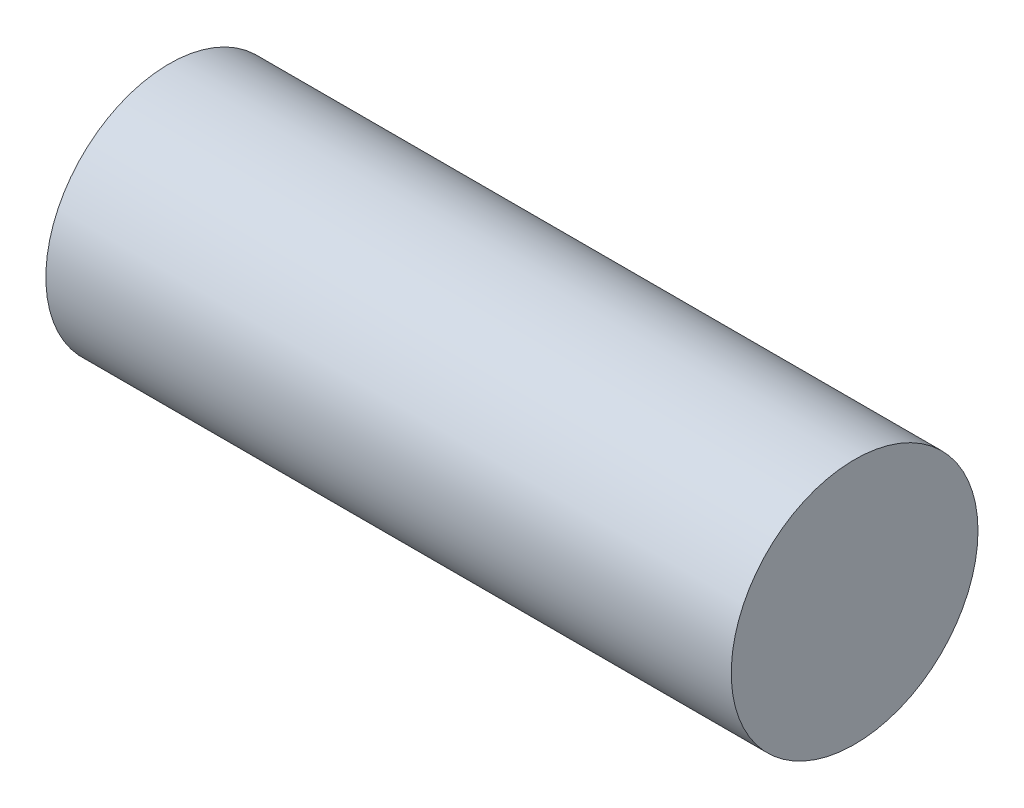
ISO-10303-21;
HEADER;
FILE_DESCRIPTION(('STEP AP214'),'2;1');
FILE_NAME('part.step','',(''),(''),'','','');
FILE_SCHEMA(('AUTOMOTIVE_DESIGN { 1 0 10303 214 1 1 1 1 }'));
ENDSEC;
DATA;
#1=APPLICATION_CONTEXT('core data for automotive mechanical design processes');
#2=APPLICATION_PROTOCOL_DEFINITION('international standard','automotive_design',2000,#1);
#3=PRODUCT_CONTEXT('',#1,'mechanical');
#4=PRODUCT('Part','Part','',(#3));
#5=PRODUCT_RELATED_PRODUCT_CATEGORY('part','',(#4));
#6=PRODUCT_DEFINITION_FORMATION('','',#4);
#7=PRODUCT_DEFINITION_CONTEXT('part definition',#1,'design');
#8=PRODUCT_DEFINITION('design','',#6,#7);
#9=PRODUCT_DEFINITION_SHAPE('','',#8);
#10=(LENGTH_UNIT() NAMED_UNIT(*) SI_UNIT(.MILLI.,.METRE.));
#11=(NAMED_UNIT(*) PLANE_ANGLE_UNIT() SI_UNIT($,.RADIAN.));
#12=(NAMED_UNIT(*) SI_UNIT($,.STERADIAN.) SOLID_ANGLE_UNIT());
#13=UNCERTAINTY_MEASURE_WITH_UNIT(LENGTH_MEASURE(1.E-05),#10,'distance_accuracy_value','');
#14=(GEOMETRIC_REPRESENTATION_CONTEXT(3) GLOBAL_UNCERTAINTY_ASSIGNED_CONTEXT((#13)) GLOBAL_UNIT_ASSIGNED_CONTEXT((#10,
#11,#12)) REPRESENTATION_CONTEXT('',''));
#15=CARTESIAN_POINT('',(0.,0.,0.));
#16=DIRECTION('',(0.,0.,1.));
#17=DIRECTION('',(1.,0.,0.));
#18=AXIS2_PLACEMENT_3D('',#15,#16,#17);
#19=CARTESIAN_POINT('',(12.5,0.,0.));
#20=DIRECTION('',(-1.,0.,0.));
#21=DIRECTION('',(0.,0.,1.));
#22=AXIS2_PLACEMENT_3D('',#19,#20,#21);
#23=CYLINDRICAL_SURFACE('',#22,2.25);
#24=CARTESIAN_POINT('',(12.5,0.,0.));
#25=DIRECTION('',(1.,0.,0.));
#26=DIRECTION('',(0.,0.,-1.));
#27=AXIS2_PLACEMENT_3D('',#24,#25,#26);
#28=CIRCLE('',#27,2.25);
#29=CARTESIAN_POINT('',(12.5,0.,-2.25));
#30=VERTEX_POINT('',#29);
#31=EDGE_CURVE('E10',#30,#30,#28,.T.);
#32=ORIENTED_EDGE('',*,*,#31,.F.);
#33=EDGE_LOOP('',(#32));
#34=FACE_BOUND('',#33,.T.);
#35=CARTESIAN_POINT('',(0.,0.,0.));
#36=DIRECTION('',(1.,0.,0.));
#37=DIRECTION('',(0.,0.,-1.));
#38=AXIS2_PLACEMENT_3D('',#35,#36,#37);
#39=CIRCLE('',#38,2.25);
#40=CARTESIAN_POINT('',(0.,0.,-2.25));
#41=VERTEX_POINT('',#40);
#42=EDGE_CURVE('E40',#41,#41,#39,.T.);
#43=ORIENTED_EDGE('',*,*,#42,.T.);
#44=EDGE_LOOP('',(#43));
#45=FACE_BOUND('',#44,.T.);
#46=ADVANCED_FACE('F37',(#34,#45),#23,.T.);
#47=CARTESIAN_POINT('',(12.5,0.,0.));
#48=DIRECTION('',(1.,0.,0.));
#49=DIRECTION('',(0.,0.,-1.));
#50=AXIS2_PLACEMENT_3D('',#47,#48,#49);
#51=PLANE('',#50);
#52=ORIENTED_EDGE('',*,*,#31,.T.);
#53=EDGE_LOOP('',(#52));
#54=FACE_BOUND('',#53,.T.);
#55=ADVANCED_FACE('F54',(#54),#51,.T.);
#56=CARTESIAN_POINT('',(0.,0.,0.));
#57=DIRECTION('',(1.,0.,0.));
#58=DIRECTION('',(0.,0.,-1.));
#59=AXIS2_PLACEMENT_3D('',#56,#57,#58);
#60=PLANE('',#59);
#61=ORIENTED_EDGE('',*,*,#42,.F.);
#62=EDGE_LOOP('',(#61));
#63=FACE_BOUND('',#62,.T.);
#64=ADVANCED_FACE('F52',(#63),#60,.F.);
#65=CLOSED_SHELL('',(#46,#55,#64));
#66=MANIFOLD_SOLID_BREP('B2',#65);
#67=ADVANCED_BREP_SHAPE_REPRESENTATION('',(#18,#66),#14);
#68=SHAPE_DEFINITION_REPRESENTATION(#9,#67);
ENDSEC;
END-ISO-10303-21;
